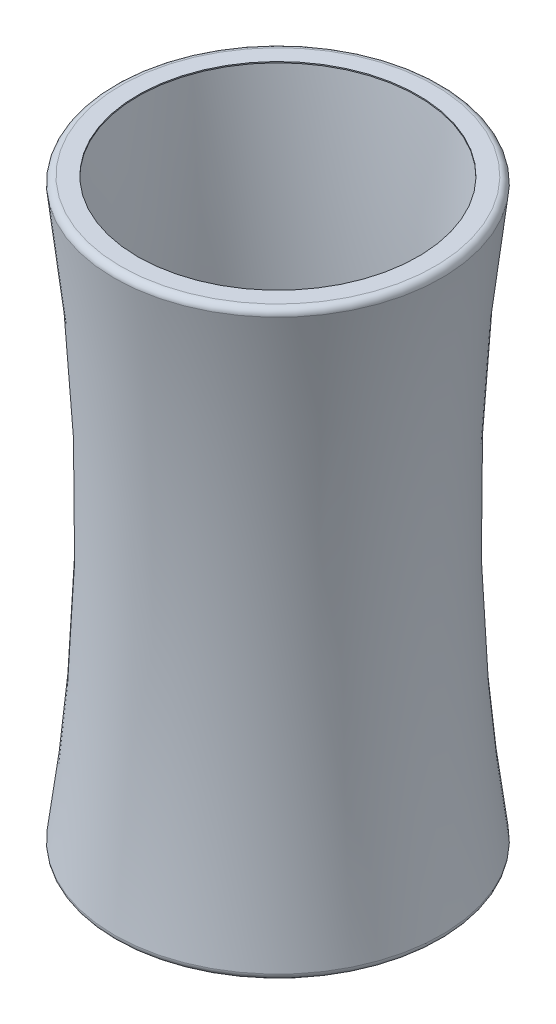
ISO-10303-21;
HEADER;
FILE_DESCRIPTION(('STEP AP214'),'2;1');
FILE_NAME('part.step','',(''),(''),'','','');
FILE_SCHEMA(('AUTOMOTIVE_DESIGN { 1 0 10303 214 1 1 1 1 }'));
ENDSEC;
DATA;
#1=APPLICATION_CONTEXT('core data for automotive mechanical design processes');
#2=APPLICATION_PROTOCOL_DEFINITION('international standard','automotive_design',2000,#1);
#3=PRODUCT_CONTEXT('',#1,'mechanical');
#4=PRODUCT('Part','Part','',(#3));
#5=PRODUCT_RELATED_PRODUCT_CATEGORY('part','',(#4));
#6=PRODUCT_DEFINITION_FORMATION('','',#4);
#7=PRODUCT_DEFINITION_CONTEXT('part definition',#1,'design');
#8=PRODUCT_DEFINITION('design','',#6,#7);
#9=PRODUCT_DEFINITION_SHAPE('','',#8);
#10=(LENGTH_UNIT() NAMED_UNIT(*) SI_UNIT(.MILLI.,.METRE.));
#11=(NAMED_UNIT(*) PLANE_ANGLE_UNIT() SI_UNIT($,.RADIAN.));
#12=(NAMED_UNIT(*) SI_UNIT($,.STERADIAN.) SOLID_ANGLE_UNIT());
#13=UNCERTAINTY_MEASURE_WITH_UNIT(LENGTH_MEASURE(1.E-05),#10,'distance_accuracy_value','');
#14=(GEOMETRIC_REPRESENTATION_CONTEXT(3) GLOBAL_UNCERTAINTY_ASSIGNED_CONTEXT((#13)) GLOBAL_UNIT_ASSIGNED_CONTEXT((#10,
#11,#12)) REPRESENTATION_CONTEXT('',''));
#15=CARTESIAN_POINT('',(0.,0.,0.));
#16=DIRECTION('',(0.,0.,1.));
#17=DIRECTION('',(1.,0.,0.));
#18=AXIS2_PLACEMENT_3D('',#15,#16,#17);
#19=CARTESIAN_POINT('',(12.5,-114.686619695835,0.));
#20=DIRECTION('',(0.,-1.,0.));
#21=DIRECTION('',(0.,0.,-1.));
#22=AXIS2_PLACEMENT_3D('',#19,#20,#21);
#23=PLANE('',#22);
#24=CARTESIAN_POINT('',(0.,-114.686619695835,0.));
#25=DIRECTION('',(0.,1.,0.));
#26=DIRECTION('',(0.,0.,1.));
#27=AXIS2_PLACEMENT_3D('',#24,#25,#26);
#28=CIRCLE('',#27,12.5);
#29=CARTESIAN_POINT('',(0.,-114.686619695835,12.5));
#30=VERTEX_POINT('',#29);
#31=EDGE_CURVE('E71',#30,#30,#28,.T.);
#32=ORIENTED_EDGE('',*,*,#31,.F.);
#33=EDGE_LOOP('',(#32));
#34=FACE_BOUND('',#33,.T.);
#35=CARTESIAN_POINT('',(0.,-114.686619695835,0.));
#36=DIRECTION('',(0.,1.,0.));
#37=DIRECTION('',(0.,0.,1.));
#38=AXIS2_PLACEMENT_3D('',#35,#36,#37);
#39=CIRCLE('',#38,14.0045316945565);
#40=CARTESIAN_POINT('',(0.,-114.686619695835,14.0045316945565));
#41=VERTEX_POINT('',#40);
#42=EDGE_CURVE('E10',#41,#41,#39,.T.);
#43=ORIENTED_EDGE('',*,*,#42,.T.);
#44=EDGE_LOOP('',(#43));
#45=FACE_BOUND('',#44,.T.);
#46=ADVANCED_FACE('F31',(#34,#45),#23,.F.);
#47=CARTESIAN_POINT('',(0.,-115.286307843071,0.));
#48=DIRECTION('',(0.,1.,0.));
#49=DIRECTION('',(0.,0.,1.));
#50=AXIS2_PLACEMENT_3D('',#47,#48,#49);
#51=TOROIDAL_SURFACE('',#50,14.0045316945565,0.599688147235476);
#52=ORIENTED_EDGE('',*,*,#42,.F.);
#53=EDGE_LOOP('',(#52));
#54=FACE_BOUND('',#53,.T.);
#55=CARTESIAN_POINT('',(0.,-115.286307843071,0.));
#56=DIRECTION('',(0.,1.,0.));
#57=DIRECTION('',(0.,0.,1.));
#58=AXIS2_PLACEMENT_3D('',#55,#56,#57);
#59=CIRCLE('',#58,14.6042198417919);
#60=CARTESIAN_POINT('',(0.,-115.286307843071,14.6042198417919));
#61=VERTEX_POINT('',#60);
#62=EDGE_CURVE('E37',#61,#61,#59,.T.);
#63=ORIENTED_EDGE('',*,*,#62,.T.);
#64=EDGE_LOOP('',(#63));
#65=FACE_BOUND('',#64,.T.);
#66=ADVANCED_FACE('F78',(#54,#65),#51,.T.);
#67=CARTESIAN_POINT('',(0.,-140.661619695835,0.));
#68=DIRECTION('',(0.,1.,0.));
#69=DIRECTION('',(0.,0.,1.));
#70=AXIS2_PLACEMENT_3D('',#67,#68,#69);
#71=TOROIDAL_SURFACE('',#70,192.706614742576,179.900999221849);
#72=ORIENTED_EDGE('',*,*,#62,.F.);
#73=EDGE_LOOP('',(#72));
#74=FACE_BOUND('',#73,.T.);
#75=CARTESIAN_POINT('',(0.,-166.0369315486,0.));
#76=DIRECTION('',(0.,1.,0.));
#77=DIRECTION('',(0.,0.,1.));
#78=AXIS2_PLACEMENT_3D('',#75,#76,#77);
#79=CIRCLE('',#78,14.6042198417919);
#80=CARTESIAN_POINT('',(0.,-166.0369315486,14.6042198417919));
#81=VERTEX_POINT('',#80);
#82=EDGE_CURVE('E41',#81,#81,#79,.T.);
#83=ORIENTED_EDGE('',*,*,#82,.T.);
#84=EDGE_LOOP('',(#83));
#85=FACE_BOUND('',#84,.T.);
#86=ADVANCED_FACE('F82',(#74,#85),#71,.F.);
#87=CARTESIAN_POINT('',(0.,-166.0369315486,0.));
#88=DIRECTION('',(0.,1.,0.));
#89=DIRECTION('',(0.,0.,1.));
#90=AXIS2_PLACEMENT_3D('',#87,#88,#89);
#91=TOROIDAL_SURFACE('',#90,14.0045316945565,0.599688147235469);
#92=ORIENTED_EDGE('',*,*,#82,.F.);
#93=EDGE_LOOP('',(#92));
#94=FACE_BOUND('',#93,.T.);
#95=CARTESIAN_POINT('',(0.,-166.636619695835,0.));
#96=DIRECTION('',(0.,1.,0.));
#97=DIRECTION('',(0.,0.,1.));
#98=AXIS2_PLACEMENT_3D('',#95,#96,#97);
#99=CIRCLE('',#98,14.0045316945565);
#100=CARTESIAN_POINT('',(0.,-166.636619695835,14.0045316945565));
#101=VERTEX_POINT('',#100);
#102=EDGE_CURVE('E45',#101,#101,#99,.T.);
#103=ORIENTED_EDGE('',*,*,#102,.T.);
#104=EDGE_LOOP('',(#103));
#105=FACE_BOUND('',#104,.T.);
#106=ADVANCED_FACE('F87',(#94,#105),#91,.T.);
#107=CARTESIAN_POINT('',(14.0045316945565,-166.636619695835,0.));
#108=DIRECTION('',(0.,1.,0.));
#109=DIRECTION('',(0.,0.,1.));
#110=AXIS2_PLACEMENT_3D('',#107,#108,#109);
#111=PLANE('',#110);
#112=ORIENTED_EDGE('',*,*,#102,.F.);
#113=EDGE_LOOP('',(#112));
#114=FACE_BOUND('',#113,.T.);
#115=CARTESIAN_POINT('',(0.,-166.636619695835,0.));
#116=DIRECTION('',(0.,1.,0.));
#117=DIRECTION('',(0.,0.,1.));
#118=AXIS2_PLACEMENT_3D('',#115,#116,#117);
#119=CIRCLE('',#118,11.3189414730029);
#120=CARTESIAN_POINT('',(0.,-166.636619695835,11.3189414730029));
#121=VERTEX_POINT('',#120);
#122=EDGE_CURVE('E50',#121,#121,#119,.T.);
#123=ORIENTED_EDGE('',*,*,#122,.T.);
#124=EDGE_LOOP('',(#123));
#125=FACE_BOUND('',#124,.T.);
#126=ADVANCED_FACE('F93',(#114,#125),#111,.F.);
#127=CARTESIAN_POINT('',(0.,0.,0.));
#128=DIRECTION('',(0.,1.,0.));
#129=DIRECTION('',(0.,0.,1.));
#130=AXIS2_PLACEMENT_3D('',#127,#128,#129);
#131=CYLINDRICAL_SURFACE('',#130,11.3189414730029);
#132=ORIENTED_EDGE('',*,*,#122,.F.);
#133=EDGE_LOOP('',(#132));
#134=FACE_BOUND('',#133,.T.);
#135=CARTESIAN_POINT('',(0.,-166.536619695835,0.));
#136=DIRECTION('',(0.,1.,0.));
#137=DIRECTION('',(0.,0.,1.));
#138=AXIS2_PLACEMENT_3D('',#135,#136,#137);
#139=CIRCLE('',#138,11.3189414730029);
#140=CARTESIAN_POINT('',(0.,-166.536619695835,11.3189414730029));
#141=VERTEX_POINT('',#140);
#142=EDGE_CURVE('E53',#141,#141,#139,.T.);
#143=ORIENTED_EDGE('',*,*,#142,.T.);
#144=EDGE_LOOP('',(#143));
#145=FACE_BOUND('',#144,.T.);
#146=ADVANCED_FACE('F97',(#134,#145),#131,.F.);
#147=CARTESIAN_POINT('',(14.0045316945565,-166.536619695835,0.));
#148=DIRECTION('',(0.,-1.,0.));
#149=DIRECTION('',(0.,0.,-1.));
#150=AXIS2_PLACEMENT_3D('',#147,#148,#149);
#151=PLANE('',#150);
#152=ORIENTED_EDGE('',*,*,#142,.F.);
#153=EDGE_LOOP('',(#152));
#154=FACE_BOUND('',#153,.T.);
#155=CARTESIAN_POINT('',(0.,-166.536619695835,0.));
#156=DIRECTION('',(0.,1.,0.));
#157=DIRECTION('',(0.,0.,1.));
#158=AXIS2_PLACEMENT_3D('',#155,#156,#157);
#159=CIRCLE('',#158,14.0045316945565);
#160=CARTESIAN_POINT('',(0.,-166.536619695835,14.0045316945565));
#161=VERTEX_POINT('',#160);
#162=EDGE_CURVE('E56',#161,#161,#159,.T.);
#163=ORIENTED_EDGE('',*,*,#162,.T.);
#164=EDGE_LOOP('',(#163));
#165=FACE_BOUND('',#164,.T.);
#166=ADVANCED_FACE('F101',(#154,#165),#151,.F.);
#167=CARTESIAN_POINT('',(0.,-166.0369315486,0.));
#168=DIRECTION('',(0.,1.,0.));
#169=DIRECTION('',(0.,0.,1.));
#170=AXIS2_PLACEMENT_3D('',#167,#168,#169);
#171=TOROIDAL_SURFACE('',#170,14.0045316945565,0.499688147235463);
#172=ORIENTED_EDGE('',*,*,#162,.F.);
#173=EDGE_LOOP('',(#172));
#174=FACE_BOUND('',#173,.T.);
#175=CARTESIAN_POINT('',(0.,-166.0369315486,0.));
#176=DIRECTION('',(0.,1.,0.));
#177=DIRECTION('',(0.,0.,1.));
#178=AXIS2_PLACEMENT_3D('',#175,#176,#177);
#179=CIRCLE('',#178,14.504219841792);
#180=CARTESIAN_POINT('',(0.,-166.0369315486,14.504219841792));
#181=VERTEX_POINT('',#180);
#182=EDGE_CURVE('E59',#181,#181,#179,.T.);
#183=ORIENTED_EDGE('',*,*,#182,.T.);
#184=EDGE_LOOP('',(#183));
#185=FACE_BOUND('',#184,.T.);
#186=ADVANCED_FACE('F105',(#174,#185),#171,.F.);
#187=CARTESIAN_POINT('',(0.,-140.661619695835,0.));
#188=DIRECTION('',(0.,1.,0.));
#189=DIRECTION('',(0.,0.,1.));
#190=AXIS2_PLACEMENT_3D('',#187,#188,#189);
#191=TOROIDAL_SURFACE('',#190,192.706614742576,180.);
#192=ORIENTED_EDGE('',*,*,#182,.F.);
#193=EDGE_LOOP('',(#192));
#194=FACE_BOUND('',#193,.T.);
#195=CARTESIAN_POINT('',(0.,-115.286307843071,0.));
#196=DIRECTION('',(0.,1.,0.));
#197=DIRECTION('',(0.,0.,1.));
#198=AXIS2_PLACEMENT_3D('',#195,#196,#197);
#199=CIRCLE('',#198,14.5042198417919);
#200=CARTESIAN_POINT('',(0.,-115.286307843071,14.5042198417919));
#201=VERTEX_POINT('',#200);
#202=EDGE_CURVE('E62',#201,#201,#199,.T.);
#203=ORIENTED_EDGE('',*,*,#202,.T.);
#204=EDGE_LOOP('',(#203));
#205=FACE_BOUND('',#204,.T.);
#206=ADVANCED_FACE('F109',(#194,#205),#191,.T.);
#207=CARTESIAN_POINT('',(0.,-115.286307843071,0.));
#208=DIRECTION('',(0.,1.,0.));
#209=DIRECTION('',(0.,0.,1.));
#210=AXIS2_PLACEMENT_3D('',#207,#208,#209);
#211=TOROIDAL_SURFACE('',#210,14.0045316945565,0.499688147235477);
#212=ORIENTED_EDGE('',*,*,#202,.F.);
#213=EDGE_LOOP('',(#212));
#214=FACE_BOUND('',#213,.T.);
#215=CARTESIAN_POINT('',(0.,-114.786619695835,0.));
#216=DIRECTION('',(0.,1.,0.));
#217=DIRECTION('',(0.,0.,1.));
#218=AXIS2_PLACEMENT_3D('',#215,#216,#217);
#219=CIRCLE('',#218,14.0045316945565);
#220=CARTESIAN_POINT('',(0.,-114.786619695835,14.0045316945565));
#221=VERTEX_POINT('',#220);
#222=EDGE_CURVE('E65',#221,#221,#219,.T.);
#223=ORIENTED_EDGE('',*,*,#222,.T.);
#224=EDGE_LOOP('',(#223));
#225=FACE_BOUND('',#224,.T.);
#226=ADVANCED_FACE('F113',(#214,#225),#211,.F.);
#227=CARTESIAN_POINT('',(12.5,-114.786619695835,0.));
#228=DIRECTION('',(0.,1.,0.));
#229=DIRECTION('',(0.,0.,1.));
#230=AXIS2_PLACEMENT_3D('',#227,#228,#229);
#231=PLANE('',#230);
#232=ORIENTED_EDGE('',*,*,#222,.F.);
#233=EDGE_LOOP('',(#232));
#234=FACE_BOUND('',#233,.T.);
#235=CARTESIAN_POINT('',(0.,-114.786619695835,0.));
#236=DIRECTION('',(0.,1.,0.));
#237=DIRECTION('',(0.,0.,1.));
#238=AXIS2_PLACEMENT_3D('',#235,#236,#237);
#239=CIRCLE('',#238,12.5);
#240=CARTESIAN_POINT('',(0.,-114.786619695835,12.5));
#241=VERTEX_POINT('',#240);
#242=EDGE_CURVE('E68',#241,#241,#239,.T.);
#243=ORIENTED_EDGE('',*,*,#242,.T.);
#244=EDGE_LOOP('',(#243));
#245=FACE_BOUND('',#244,.T.);
#246=ADVANCED_FACE('F117',(#234,#245),#231,.F.);
#247=CARTESIAN_POINT('',(0.,0.,0.));
#248=DIRECTION('',(0.,1.,0.));
#249=DIRECTION('',(0.,0.,1.));
#250=AXIS2_PLACEMENT_3D('',#247,#248,#249);
#251=CYLINDRICAL_SURFACE('',#250,12.5);
#252=ORIENTED_EDGE('',*,*,#242,.F.);
#253=EDGE_LOOP('',(#252));
#254=FACE_BOUND('',#253,.T.);
#255=ORIENTED_EDGE('',*,*,#31,.T.);
#256=EDGE_LOOP('',(#255));
#257=FACE_BOUND('',#256,.T.);
#258=ADVANCED_FACE('F75',(#254,#257),#251,.F.);
#259=CLOSED_SHELL('',(#46,#66,#86,#106,#126,#146,#166,#186,#206,#226,#246,#258));
#260=MANIFOLD_SOLID_BREP('B2',#259);
#261=ADVANCED_BREP_SHAPE_REPRESENTATION('',(#18,#260),#14);
#262=SHAPE_DEFINITION_REPRESENTATION(#9,#261);
ENDSEC;
END-ISO-10303-21;
